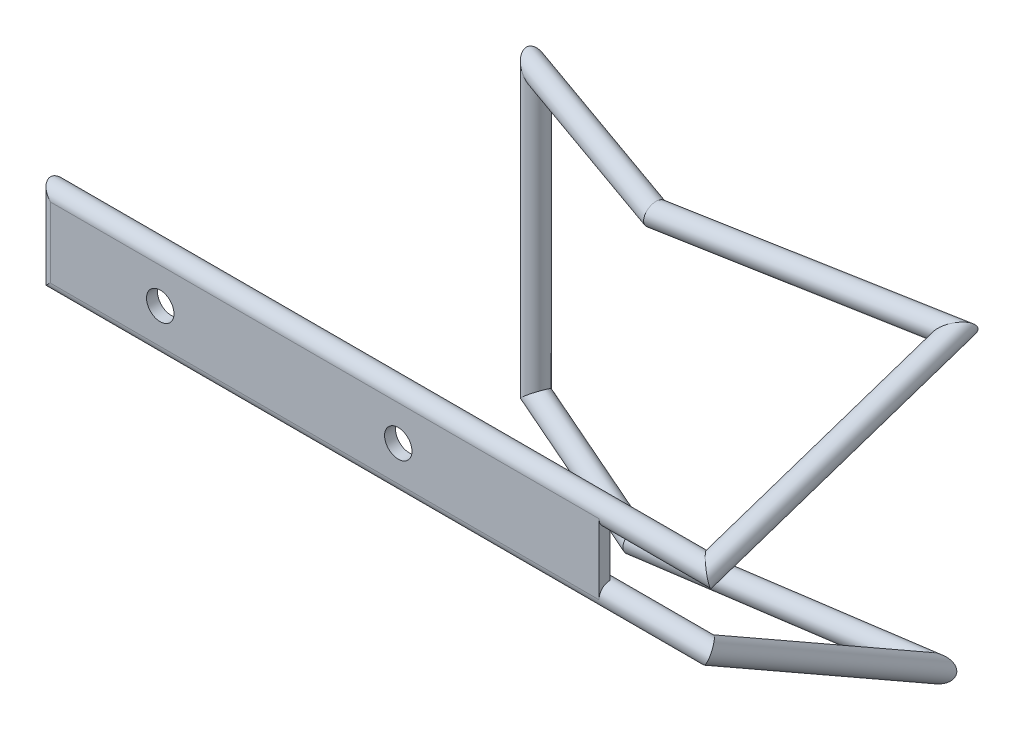
ISO-10303-21;
HEADER;
FILE_DESCRIPTION(('STEP AP214'),'2;1');
FILE_NAME('part.step','',(''),(''),'','','');
FILE_SCHEMA(('AUTOMOTIVE_DESIGN { 1 0 10303 214 1 1 1 1 }'));
ENDSEC;
DATA;
#1=APPLICATION_CONTEXT('core data for automotive mechanical design processes');
#2=APPLICATION_PROTOCOL_DEFINITION('international standard','automotive_design',2000,#1);
#3=PRODUCT_CONTEXT('',#1,'mechanical');
#4=PRODUCT('Part','Part','',(#3));
#5=PRODUCT_RELATED_PRODUCT_CATEGORY('part','',(#4));
#6=PRODUCT_DEFINITION_FORMATION('','',#4);
#7=PRODUCT_DEFINITION_CONTEXT('part definition',#1,'design');
#8=PRODUCT_DEFINITION('design','',#6,#7);
#9=PRODUCT_DEFINITION_SHAPE('','',#8);
#10=(LENGTH_UNIT() NAMED_UNIT(*) SI_UNIT(.MILLI.,.METRE.));
#11=(NAMED_UNIT(*) PLANE_ANGLE_UNIT() SI_UNIT($,.RADIAN.));
#12=(NAMED_UNIT(*) SI_UNIT($,.STERADIAN.) SOLID_ANGLE_UNIT());
#13=UNCERTAINTY_MEASURE_WITH_UNIT(LENGTH_MEASURE(1.E-05),#10,'distance_accuracy_value','');
#14=(GEOMETRIC_REPRESENTATION_CONTEXT(3) GLOBAL_UNCERTAINTY_ASSIGNED_CONTEXT((#13)) GLOBAL_UNIT_ASSIGNED_CONTEXT((#10,
#11,#12)) REPRESENTATION_CONTEXT('',''));
#15=CARTESIAN_POINT('',(0.,0.,0.));
#16=DIRECTION('',(0.,0.,1.));
#17=DIRECTION('',(1.,0.,0.));
#18=AXIS2_PLACEMENT_3D('',#15,#16,#17);
#19=CARTESIAN_POINT('',(153.652033502107,-16.1608985506887,-0.00367353823629841));
#20=DIRECTION('',(-1.,0.,0.));
#21=DIRECTION('',(0.,-1.,0.));
#22=AXIS2_PLACEMENT_3D('',#19,#20,#21);
#23=CYLINDRICAL_SURFACE('',#22,2.54);
#24=CARTESIAN_POINT('',(149.86,-16.1608985506887,-0.00367353823629846));
#25=DIRECTION('',(-0.707106781186546,0.350174368269665,0.614310924375387));
#26=DIRECTION('',(-0.707106781186549,-0.350174368269664,-0.614310924375385));
#27=AXIS2_PLACEMENT_3D('',#24,#25,#26);
#28=ELLIPSE('',#27,3.59210244842767,2.54);
#29=CARTESIAN_POINT('',(147.32,-17.4187607563268,-2.21034131378098));
#30=VERTEX_POINT('',#29);
#31=EDGE_CURVE('E164',#30,#30,#28,.F.);
#32=ORIENTED_EDGE('',*,*,#31,.F.);
#33=EDGE_LOOP('',(#32));
#34=FACE_BOUND('',#33,.T.);
#35=CARTESIAN_POINT('',(0.,-16.1608985506887,-0.00367353823630032));
#36=DIRECTION('',(-0.707106781186547,0.707106762918459,0.000160732630215336));
#37=DIRECTION('',(0.707106781186548,0.707106762918459,0.000160732630215353));
#38=AXIS2_PLACEMENT_3D('',#35,#36,#37);
#39=ELLIPSE('',#38,3.59210244842766,2.54);
#40=CARTESIAN_POINT('',(0.,-16.1614759187632,2.53632639614285));
#41=VERTEX_POINT('',#40);
#42=CARTESIAN_POINT('',(2.5399981129377,-13.6209012071632,0.));
#43=VERTEX_POINT('',#42);
#44=EDGE_CURVE('E156',#41,#43,#39,.F.);
#45=ORIENTED_EDGE('',*,*,#44,.T.);
#46=DIRECTION('',(-1.,0.,0.));
#47=VECTOR('',#46,1.);
#48=CARTESIAN_POINT('',(153.652033502107,-13.6209012071632,0.));
#49=LINE('',#48,#47);
#50=CARTESIAN_POINT('',(127.,-13.6209012071632,0.));
#51=VERTEX_POINT('',#50);
#52=EDGE_CURVE('E67',#43,#51,#49,.F.);
#53=ORIENTED_EDGE('',*,*,#52,.T.);
#54=CARTESIAN_POINT('',(127.,-16.1608985506887,-0.00367353823629874));
#55=DIRECTION('',(-1.,0.,0.));
#56=DIRECTION('',(0.,0.,1.));
#57=AXIS2_PLACEMENT_3D('',#54,#55,#56);
#58=CIRCLE('',#57,2.54);
#59=CARTESIAN_POINT('',(127.,-16.256,2.53454546617189));
#60=VERTEX_POINT('',#59);
#61=EDGE_CURVE('E122',#51,#60,#58,.F.);
#62=ORIENTED_EDGE('',*,*,#61,.T.);
#63=DIRECTION('',(-1.,0.,0.));
#64=VECTOR('',#63,1.);
#65=CARTESIAN_POINT('',(153.652033502107,-16.256,2.53454546617189));
#66=LINE('',#65,#64);
#67=CARTESIAN_POINT('',(0.,-16.256,2.53454546617189));
#68=VERTEX_POINT('',#67);
#69=EDGE_CURVE('E11',#60,#68,#66,.T.);
#70=ORIENTED_EDGE('',*,*,#69,.T.);
#71=CARTESIAN_POINT('',(0.,-16.1608985506887,-0.00367353823630032));
#72=DIRECTION('',(1.,0.,0.));
#73=DIRECTION('',(0.,1.,0.));
#74=AXIS2_PLACEMENT_3D('',#71,#72,#73);
#75=CIRCLE('',#74,2.54);
#76=EDGE_CURVE('E120',#68,#41,#75,.F.);
#77=ORIENTED_EDGE('',*,*,#76,.T.);
#78=EDGE_LOOP('',(#45,#53,#62,#70,#77));
#79=FACE_BOUND('',#78,.T.);
#80=ADVANCED_FACE('F43',(#34,#79),#23,.T.);
#81=CARTESIAN_POINT('',(0.,-22.4679728476881,-0.00510720100673716));
#82=DIRECTION('',(0.,0.999999974165021,0.00022731026556644));
#83=DIRECTION('',(0.,-0.00022731026556644,0.999999974165021));
#84=AXIS2_PLACEMENT_3D('',#81,#82,#83);
#85=CYLINDRICAL_SURFACE('',#84,2.54);
#86=CARTESIAN_POINT('',(0.,0.,0.));
#87=DIRECTION('',(0.707106781186547,0.707106762918459,0.000160732630215345));
#88=DIRECTION('',(0.707106781186548,-0.707106762918459,-0.000160732630215345));
#89=AXIS2_PLACEMENT_3D('',#86,#87,#88);
#90=ELLIPSE('',#89,3.59210244842766,2.54);
#91=CARTESIAN_POINT('',(0.,-0.000577368074539625,2.54));
#92=VERTEX_POINT('',#91);
#93=CARTESIAN_POINT('',(2.53999993437915,-2.54,0.));
#94=VERTEX_POINT('',#93);
#95=EDGE_CURVE('E148',#92,#94,#90,.F.);
#96=ORIENTED_EDGE('',*,*,#95,.T.);
#97=CARTESIAN_POINT('',(0.,1.98840943710366E-10,0.));
#98=DIRECTION('',(0.,0.,1.));
#99=DIRECTION('',(0.,1.,0.));
#100=AXIS2_PLACEMENT_3D('',#97,#98,#99);
#101=ELLIPSE('',#100,11174.1543817676,2.54);
#102=EDGE_CURVE('E137',#94,#43,#101,.F.);
#103=ORIENTED_EDGE('',*,*,#102,.T.);
#104=ORIENTED_EDGE('',*,*,#44,.F.);
#105=DIRECTION('',(0.,0.999999974165021,0.00022731026556644));
#106=VECTOR('',#105,1.);
#107=CARTESIAN_POINT('',(0.,-22.4685502157626,2.53489273337242));
#108=LINE('',#107,#106);
#109=EDGE_CURVE('E127',#41,#92,#108,.T.);
#110=ORIENTED_EDGE('',*,*,#109,.T.);
#111=EDGE_LOOP('',(#96,#103,#104,#110));
#112=FACE_BOUND('',#111,.T.);
#113=ADVANCED_FACE('F193',(#112),#85,.T.);
#114=CARTESIAN_POINT('',(-5.68863496051613,0.,0.));
#115=DIRECTION('',(1.,0.,0.));
#116=DIRECTION('',(0.,0.,-1.));
#117=AXIS2_PLACEMENT_3D('',#114,#115,#116);
#118=CYLINDRICAL_SURFACE('',#117,2.54);
#119=CARTESIAN_POINT('',(149.86,0.,0.));
#120=DIRECTION('',(0.707106781186548,0.224152965886128,-0.670638090093645));
#121=DIRECTION('',(0.707106781186547,-0.224152965886128,0.670638090093646));
#122=AXIS2_PLACEMENT_3D('',#119,#120,#121);
#123=ELLIPSE('',#122,3.59210244842766,2.54);
#124=CARTESIAN_POINT('',(152.4,-0.805180417581882,2.40900072543423));
#125=VERTEX_POINT('',#124);
#126=EDGE_CURVE('E143',#125,#125,#123,.F.);
#127=ORIENTED_EDGE('',*,*,#126,.T.);
#128=EDGE_LOOP('',(#127));
#129=FACE_BOUND('',#128,.T.);
#130=CARTESIAN_POINT('',(127.,0.,0.));
#131=DIRECTION('',(-1.,0.,0.));
#132=DIRECTION('',(0.,0.,1.));
#133=AXIS2_PLACEMENT_3D('',#130,#131,#132);
#134=CIRCLE('',#133,2.54);
#135=CARTESIAN_POINT('',(127.,0.,2.54));
#136=VERTEX_POINT('',#135);
#137=CARTESIAN_POINT('',(127.,-2.54,0.));
#138=VERTEX_POINT('',#137);
#139=EDGE_CURVE('E147',#136,#138,#134,.F.);
#140=ORIENTED_EDGE('',*,*,#139,.T.);
#141=DIRECTION('',(1.,0.,0.));
#142=VECTOR('',#141,1.);
#143=CARTESIAN_POINT('',(-5.68863496051613,-2.54,0.));
#144=LINE('',#143,#142);
#145=EDGE_CURVE('E52',#138,#94,#144,.F.);
#146=ORIENTED_EDGE('',*,*,#145,.T.);
#147=ORIENTED_EDGE('',*,*,#95,.F.);
#148=DIRECTION('',(0.,-1.,0.));
#149=VECTOR('',#148,1.);
#150=CARTESIAN_POINT('',(0.,0.,2.54));
#151=LINE('',#150,#149);
#152=CARTESIAN_POINT('',(0.,0.,2.54));
#153=VERTEX_POINT('',#152);
#154=EDGE_CURVE('E103',#153,#92,#151,.T.);
#155=ORIENTED_EDGE('',*,*,#154,.F.);
#156=DIRECTION('',(-1.,0.,0.));
#157=VECTOR('',#156,1.);
#158=CARTESIAN_POINT('',(0.,0.,2.54));
#159=LINE('',#158,#157);
#160=EDGE_CURVE('E129',#136,#153,#159,.T.);
#161=ORIENTED_EDGE('',*,*,#160,.F.);
#162=EDGE_LOOP('',(#140,#146,#147,#155,#161));
#163=FACE_BOUND('',#162,.T.);
#164=ADVANCED_FACE('F189',(#129,#163),#118,.T.);
#165=CARTESIAN_POINT('',(50.1269368479908,-38.805331725812,-56.5444345508799));
#166=DIRECTION('',(0.931905490948723,-0.116798406870942,0.343380675187218));
#167=DIRECTION('',(0.345747091551687,0.,-0.938327740548871));
#168=AXIS2_PLACEMENT_3D('',#165,#166,#167);
#169=CYLINDRICAL_SURFACE('',#168,2.54);
#170=CARTESIAN_POINT('',(55.1172396709555,-39.4307807924684,-54.7056498571726));
#171=DIRECTION('',(0.623547410451701,-0.747261134701566,0.229759490518903));
#172=DIRECTION('',(-0.701175852124506,-0.664530508377552,-0.25836336395268));
#173=AXIS2_PLACEMENT_3D('',#170,#171,#172);
#174=ELLIPSE('',#173,3.39907949449881,2.54);
#175=CARTESIAN_POINT('',(52.7338872099614,-41.6895728169634,-55.5838474697139));
#176=VERTEX_POINT('',#175);
#177=EDGE_CURVE('E176',#176,#176,#174,.F.);
#178=ORIENTED_EDGE('',*,*,#177,.F.);
#179=EDGE_LOOP('',(#178));
#180=FACE_BOUND('',#179,.T.);
#181=CARTESIAN_POINT('',(91.5601287517572,-43.9982733416096,-41.2774814646901));
#182=DIRECTION('',(0.993530983711219,-0.0767731473192,0.0836783619373752));
#183=DIRECTION('',(0.0951227338736211,0.160122823584106,-0.982503102726837));
#184=AXIS2_PLACEMENT_3D('',#181,#182,#183);
#185=ELLIPSE('',#184,2.63601009654639,2.54);
#186=CARTESIAN_POINT('',(91.8108732386591,-43.5761879619544,-43.8673695633662));
#187=VERTEX_POINT('',#186);
#188=EDGE_CURVE('E142',#187,#187,#185,.F.);
#189=ORIENTED_EDGE('',*,*,#188,.T.);
#190=EDGE_LOOP('',(#189));
#191=FACE_BOUND('',#190,.T.);
#192=ADVANCED_FACE('F45',(#180,#191),#169,.T.);
#193=CARTESIAN_POINT('',(89.7846190215724,-43.9419876322292,-40.9484616824203));
#194=DIRECTION('',(0.982782697789845,-0.0311553467556125,-0.182119502781696));
#195=DIRECTION('',(-0.18220795483976,0.,-0.983260017082517));
#196=AXIS2_PLACEMENT_3D('',#193,#194,#195);
#197=CYLINDRICAL_SURFACE('',#196,2.54);
#198=ORIENTED_EDGE('',*,*,#188,.F.);
#199=EDGE_LOOP('',(#198));
#200=FACE_BOUND('',#199,.T.);
#201=CARTESIAN_POINT('',(149.86,-45.8464466037471,-52.0810330410908));
#202=DIRECTION('',(0.764469229788913,0.360979262087118,0.534116812175937));
#203=DIRECTION('',(-0.641465848762249,0.343567982436397,0.685917346563207));
#204=AXIS2_PLACEMENT_3D('',#201,#202,#203);
#205=ELLIPSE('',#204,3.95153852022546,2.54);
#206=CARTESIAN_POINT('',(147.325222989207,-44.4888244868336,-49.3706042244554));
#207=VERTEX_POINT('',#206);
#208=EDGE_CURVE('E172',#207,#207,#205,.F.);
#209=ORIENTED_EDGE('',*,*,#208,.T.);
#210=EDGE_LOOP('',(#209));
#211=FACE_BOUND('',#210,.T.);
#212=ADVANCED_FACE('F242',(#200,#211),#197,.T.);
#213=CARTESIAN_POINT('',(55.1172396709556,32.9093966373815,-54.7056498571726));
#214=DIRECTION('',(0.,-1.,0.));
#215=DIRECTION('',(1.,0.,0.));
#216=AXIS2_PLACEMENT_3D('',#213,#214,#215);
#217=CYLINDRICAL_SURFACE('',#216,2.54);
#218=CARTESIAN_POINT('',(55.1172396709556,25.5932192075316,-54.7056498571726));
#219=DIRECTION('',(-0.742113678100972,-0.645818319246707,-0.17940453534068));
#220=DIRECTION('',(-0.627735663654482,0.763491125374329,-0.15175387326493));
#221=AXIS2_PLACEMENT_3D('',#218,#219,#220);
#222=ELLIPSE('',#221,3.93299465856387,2.54);
#223=CARTESIAN_POINT('',(52.6483586588124,28.5960257254897,-55.30249703014));
#224=VERTEX_POINT('',#223);
#225=EDGE_CURVE('E168',#224,#224,#222,.F.);
#226=ORIENTED_EDGE('',*,*,#225,.F.);
#227=EDGE_LOOP('',(#226));
#228=FACE_BOUND('',#227,.T.);
#229=ORIENTED_EDGE('',*,*,#177,.T.);
#230=EDGE_LOOP('',(#229));
#231=FACE_BOUND('',#230,.T.);
#232=ADVANCED_FACE('F262',(#228,#231),#217,.T.);
#233=CARTESIAN_POINT('',(149.86,-48.2611132511184,-56.3170829482694));
#234=DIRECTION('',(0.,0.49522134080239,0.868766840765624));
#235=DIRECTION('',(0.,-0.868766840765624,0.49522134080239));
#236=AXIS2_PLACEMENT_3D('',#233,#234,#235);
#237=CYLINDRICAL_SURFACE('',#236,2.54);
#238=ORIENTED_EDGE('',*,*,#208,.F.);
#239=EDGE_LOOP('',(#238));
#240=FACE_BOUND('',#239,.T.);
#241=ORIENTED_EDGE('',*,*,#31,.T.);
#242=EDGE_LOOP('',(#241));
#243=FACE_BOUND('',#242,.T.);
#244=ADVANCED_FACE('F258',(#240,#243),#237,.T.);
#245=CARTESIAN_POINT('',(92.6407273061185,19.1012735194814,-45.6344198526608));
#246=DIRECTION('',(-0.958541216562323,0.165837397050716,-0.231725470957909));
#247=DIRECTION('',(-0.234979201955649,0.,0.972000398481547));
#248=AXIS2_PLACEMENT_3D('',#245,#246,#247);
#249=CYLINDRICAL_SURFACE('',#248,2.54);
#250=CARTESIAN_POINT('',(91.5601287517603,19.2882280796141,-45.8956524471475));
#251=DIRECTION('',(-0.995868470482134,0.0875449087369118,-0.0241221569064847));
#252=DIRECTION('',(-0.0542156185158344,-0.360110810411345,0.931332846480693));
#253=AXIS2_PLACEMENT_3D('',#250,#251,#252);
#254=ELLIPSE('',#253,2.60595967146347,2.54);
#255=CARTESIAN_POINT('',(91.4188450363446,18.3497938304242,-43.4686366085096));
#256=VERTEX_POINT('',#255);
#257=EDGE_CURVE('E160',#256,#256,#254,.F.);
#258=ORIENTED_EDGE('',*,*,#257,.F.);
#259=EDGE_LOOP('',(#258));
#260=FACE_BOUND('',#259,.T.);
#261=ORIENTED_EDGE('',*,*,#225,.T.);
#262=EDGE_LOOP('',(#261));
#263=FACE_BOUND('',#262,.T.);
#264=ADVANCED_FACE('F255',(#260,#263),#249,.T.);
#265=CARTESIAN_POINT('',(155.457383583541,18.9748017901634,-57.9043785293699));
#266=DIRECTION('',(-0.982782697789805,0.0048207068537699,0.184702273159869));
#267=DIRECTION('',(0.184704419365155,0.,0.98279411753784));
#268=AXIS2_PLACEMENT_3D('',#265,#266,#267);
#269=CYLINDRICAL_SURFACE('',#268,2.54);
#270=CARTESIAN_POINT('',(149.86,19.0022578549324,-56.8524171202479));
#271=DIRECTION('',(-0.764469229788861,0.25033219869703,-0.594071196912908));
#272=DIRECTION('',(0.641465848762237,0.203760669731837,-0.73959661596182));
#273=AXIS2_PLACEMENT_3D('',#270,#271,#272);
#274=ELLIPSE('',#273,3.95153852022537,2.54);
#275=CARTESIAN_POINT('',(152.394777010793,19.8074259902847,-59.7749616376494));
#276=VERTEX_POINT('',#275);
#277=EDGE_CURVE('E152',#276,#276,#274,.F.);
#278=ORIENTED_EDGE('',*,*,#277,.F.);
#279=EDGE_LOOP('',(#278));
#280=FACE_BOUND('',#279,.T.);
#281=ORIENTED_EDGE('',*,*,#257,.T.);
#282=EDGE_LOOP('',(#281));
#283=FACE_BOUND('',#282,.T.);
#284=ADVANCED_FACE('F237',(#280,#283),#269,.T.);
#285=CARTESIAN_POINT('',(149.86,-1.43325211949233,4.28811396824123));
#286=DIRECTION('',(0.,0.317000164402316,-0.948425482454423));
#287=DIRECTION('',(0.,0.948425482454423,0.317000164402316));
#288=AXIS2_PLACEMENT_3D('',#285,#286,#287);
#289=CYLINDRICAL_SURFACE('',#288,2.54);
#290=ORIENTED_EDGE('',*,*,#126,.F.);
#291=EDGE_LOOP('',(#290));
#292=FACE_BOUND('',#291,.T.);
#293=ORIENTED_EDGE('',*,*,#277,.T.);
#294=EDGE_LOOP('',(#293));
#295=FACE_BOUND('',#294,.T.);
#296=ADVANCED_FACE('F228',(#292,#295),#289,.T.);
#297=CARTESIAN_POINT('',(0.,0.,2.54));
#298=DIRECTION('',(0.,0.,1.));
#299=DIRECTION('',(1.,0.,0.));
#300=AXIS2_PLACEMENT_3D('',#297,#298,#299);
#301=PLANE('',#300);
#302=CARTESIAN_POINT('',(25.4,-8.128,2.54));
#303=DIRECTION('',(0.,0.,1.));
#304=DIRECTION('',(1.,0.,0.));
#305=AXIS2_PLACEMENT_3D('',#302,#303,#304);
#306=CIRCLE('',#305,3.175);
#307=CARTESIAN_POINT('',(28.575,-8.128,2.54));
#308=VERTEX_POINT('',#307);
#309=EDGE_CURVE('E203',#308,#308,#306,.T.);
#310=ORIENTED_EDGE('',*,*,#309,.F.);
#311=EDGE_LOOP('',(#310));
#312=FACE_BOUND('',#311,.T.);
#313=ORIENTED_EDGE('',*,*,#154,.T.);
#314=CARTESIAN_POINT('',(0.,-16.256,2.54));
#315=VERTEX_POINT('',#314);
#316=EDGE_CURVE('E96',#92,#315,#151,.T.);
#317=ORIENTED_EDGE('',*,*,#316,.T.);
#318=DIRECTION('',(1.,0.,0.));
#319=VECTOR('',#318,1.);
#320=CARTESIAN_POINT('',(0.,-16.256,2.54));
#321=LINE('',#320,#319);
#322=CARTESIAN_POINT('',(127.,-16.256,2.54));
#323=VERTEX_POINT('',#322);
#324=EDGE_CURVE('E100',#315,#323,#321,.T.);
#325=ORIENTED_EDGE('',*,*,#324,.T.);
#326=DIRECTION('',(0.,1.,0.));
#327=VECTOR('',#326,1.);
#328=CARTESIAN_POINT('',(127.,0.,2.54));
#329=LINE('',#328,#327);
#330=EDGE_CURVE('E59',#323,#136,#329,.T.);
#331=ORIENTED_EDGE('',*,*,#330,.T.);
#332=ORIENTED_EDGE('',*,*,#160,.T.);
#333=EDGE_LOOP('',(#313,#317,#325,#331,#332));
#334=FACE_BOUND('',#333,.T.);
#335=CARTESIAN_POINT('',(80.518,-8.128,2.54));
#336=DIRECTION('',(0.,0.,1.));
#337=DIRECTION('',(1.,0.,0.));
#338=AXIS2_PLACEMENT_3D('',#335,#336,#337);
#339=CIRCLE('',#338,3.175);
#340=CARTESIAN_POINT('',(83.693,-8.128,2.54));
#341=VERTEX_POINT('',#340);
#342=EDGE_CURVE('E212',#341,#341,#339,.T.);
#343=ORIENTED_EDGE('',*,*,#342,.F.);
#344=EDGE_LOOP('',(#343));
#345=FACE_BOUND('',#344,.T.);
#346=ADVANCED_FACE('F98',(#312,#334,#345),#301,.T.);
#347=CARTESIAN_POINT('',(0.,0.,0.));
#348=DIRECTION('',(0.,0.,1.));
#349=DIRECTION('',(1.,0.,0.));
#350=AXIS2_PLACEMENT_3D('',#347,#348,#349);
#351=PLANE('',#350);
#352=ORIENTED_EDGE('',*,*,#52,.F.);
#353=ORIENTED_EDGE('',*,*,#102,.F.);
#354=ORIENTED_EDGE('',*,*,#145,.F.);
#355=DIRECTION('',(0.,1.,0.));
#356=VECTOR('',#355,1.);
#357=CARTESIAN_POINT('',(127.,0.,0.));
#358=LINE('',#357,#356);
#359=EDGE_CURVE('E108',#51,#138,#358,.T.);
#360=ORIENTED_EDGE('',*,*,#359,.F.);
#361=EDGE_LOOP('',(#352,#353,#354,#360));
#362=FACE_BOUND('',#361,.T.);
#363=CARTESIAN_POINT('',(25.4,-8.128,0.));
#364=DIRECTION('',(0.,0.,1.));
#365=DIRECTION('',(1.,0.,0.));
#366=AXIS2_PLACEMENT_3D('',#363,#364,#365);
#367=CIRCLE('',#366,3.175);
#368=CARTESIAN_POINT('',(28.575,-8.128,0.));
#369=VERTEX_POINT('',#368);
#370=EDGE_CURVE('E206',#369,#369,#367,.T.);
#371=ORIENTED_EDGE('',*,*,#370,.T.);
#372=EDGE_LOOP('',(#371));
#373=FACE_BOUND('',#372,.T.);
#374=CARTESIAN_POINT('',(80.518,-8.128,0.));
#375=DIRECTION('',(0.,0.,1.));
#376=DIRECTION('',(1.,0.,0.));
#377=AXIS2_PLACEMENT_3D('',#374,#375,#376);
#378=CIRCLE('',#377,3.175);
#379=CARTESIAN_POINT('',(83.693,-8.128,0.));
#380=VERTEX_POINT('',#379);
#381=EDGE_CURVE('E215',#380,#380,#378,.T.);
#382=ORIENTED_EDGE('',*,*,#381,.T.);
#383=EDGE_LOOP('',(#382));
#384=FACE_BOUND('',#383,.T.);
#385=ADVANCED_FACE('F227',(#362,#373,#384),#351,.F.);
#386=CARTESIAN_POINT('',(0.,0.,2.54));
#387=DIRECTION('',(1.,0.,0.));
#388=DIRECTION('',(0.,1.,0.));
#389=AXIS2_PLACEMENT_3D('',#386,#387,#388);
#390=PLANE('',#389);
#391=ORIENTED_EDGE('',*,*,#76,.F.);
#392=DIRECTION('',(0.,0.,-1.));
#393=VECTOR('',#392,1.);
#394=CARTESIAN_POINT('',(0.,-16.256,2.54));
#395=LINE('',#394,#393);
#396=EDGE_CURVE('E113',#315,#68,#395,.T.);
#397=ORIENTED_EDGE('',*,*,#396,.F.);
#398=ORIENTED_EDGE('',*,*,#316,.F.);
#399=ORIENTED_EDGE('',*,*,#109,.F.);
#400=EDGE_LOOP('',(#391,#397,#398,#399));
#401=FACE_BOUND('',#400,.T.);
#402=ADVANCED_FACE('F118',(#401),#390,.F.);
#403=CARTESIAN_POINT('',(0.,-16.256,2.54));
#404=DIRECTION('',(0.,1.,0.));
#405=DIRECTION('',(0.,0.,1.));
#406=AXIS2_PLACEMENT_3D('',#403,#404,#405);
#407=PLANE('',#406);
#408=ORIENTED_EDGE('',*,*,#69,.F.);
#409=DIRECTION('',(0.,0.,-1.));
#410=VECTOR('',#409,1.);
#411=CARTESIAN_POINT('',(127.,-16.256,2.54));
#412=LINE('',#411,#410);
#413=EDGE_CURVE('E115',#323,#60,#412,.T.);
#414=ORIENTED_EDGE('',*,*,#413,.F.);
#415=ORIENTED_EDGE('',*,*,#324,.F.);
#416=ORIENTED_EDGE('',*,*,#396,.T.);
#417=EDGE_LOOP('',(#408,#414,#415,#416));
#418=FACE_BOUND('',#417,.T.);
#419=ADVANCED_FACE('F112',(#418),#407,.F.);
#420=CARTESIAN_POINT('',(127.,0.,2.54));
#421=DIRECTION('',(-1.,0.,0.));
#422=DIRECTION('',(0.,0.,1.));
#423=AXIS2_PLACEMENT_3D('',#420,#421,#422);
#424=PLANE('',#423);
#425=ORIENTED_EDGE('',*,*,#61,.F.);
#426=ORIENTED_EDGE('',*,*,#359,.T.);
#427=ORIENTED_EDGE('',*,*,#139,.F.);
#428=ORIENTED_EDGE('',*,*,#330,.F.);
#429=ORIENTED_EDGE('',*,*,#413,.T.);
#430=EDGE_LOOP('',(#425,#426,#427,#428,#429));
#431=FACE_BOUND('',#430,.T.);
#432=ADVANCED_FACE('F197',(#431),#424,.F.);
#433=CARTESIAN_POINT('',(25.4,-8.128,2.54));
#434=DIRECTION('',(0.,0.,-1.));
#435=DIRECTION('',(-1.,0.,0.));
#436=AXIS2_PLACEMENT_3D('',#433,#434,#435);
#437=CYLINDRICAL_SURFACE('',#436,3.175);
#438=ORIENTED_EDGE('',*,*,#309,.T.);
#439=EDGE_LOOP('',(#438));
#440=FACE_BOUND('',#439,.T.);
#441=ORIENTED_EDGE('',*,*,#370,.F.);
#442=EDGE_LOOP('',(#441));
#443=FACE_BOUND('',#442,.T.);
#444=ADVANCED_FACE('F358',(#440,#443),#437,.F.);
#445=CARTESIAN_POINT('',(80.518,-8.128,2.54));
#446=DIRECTION('',(0.,0.,-1.));
#447=DIRECTION('',(-1.,0.,0.));
#448=AXIS2_PLACEMENT_3D('',#445,#446,#447);
#449=CYLINDRICAL_SURFACE('',#448,3.175);
#450=ORIENTED_EDGE('',*,*,#342,.T.);
#451=EDGE_LOOP('',(#450));
#452=FACE_BOUND('',#451,.T.);
#453=ORIENTED_EDGE('',*,*,#381,.F.);
#454=EDGE_LOOP('',(#453));
#455=FACE_BOUND('',#454,.T.);
#456=ADVANCED_FACE('F224',(#452,#455),#449,.F.);
#457=CLOSED_SHELL('',(#80,#113,#164,#192,#212,#232,#244,#264,#284,#296,#346,#385,#402,#419,#432,
#444,#456));
#458=MANIFOLD_SOLID_BREP('B2',#457);
#459=ADVANCED_BREP_SHAPE_REPRESENTATION('',(#18,#458),#14);
#460=SHAPE_DEFINITION_REPRESENTATION(#9,#459);
ENDSEC;
END-ISO-10303-21;
